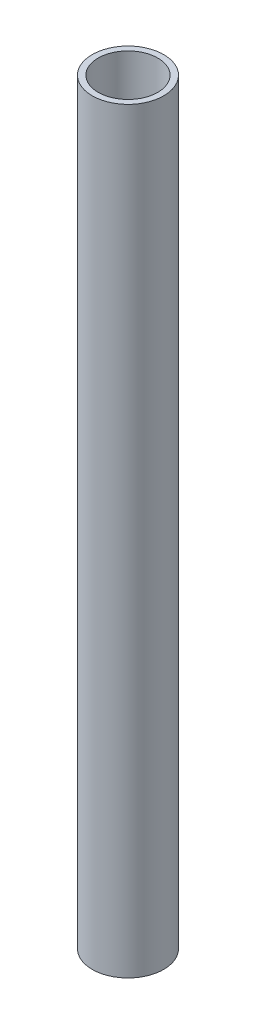
ISO-10303-21;
HEADER;
FILE_DESCRIPTION(('STEP AP214'),'2;1');
FILE_NAME('part.step','',(''),(''),'','','');
FILE_SCHEMA(('AUTOMOTIVE_DESIGN { 1 0 10303 214 1 1 1 1 }'));
ENDSEC;
DATA;
#1=APPLICATION_CONTEXT('core data for automotive mechanical design processes');
#2=APPLICATION_PROTOCOL_DEFINITION('international standard','automotive_design',2000,#1);
#3=PRODUCT_CONTEXT('',#1,'mechanical');
#4=PRODUCT('Part','Part','',(#3));
#5=PRODUCT_RELATED_PRODUCT_CATEGORY('part','',(#4));
#6=PRODUCT_DEFINITION_FORMATION('','',#4);
#7=PRODUCT_DEFINITION_CONTEXT('part definition',#1,'design');
#8=PRODUCT_DEFINITION('design','',#6,#7);
#9=PRODUCT_DEFINITION_SHAPE('','',#8);
#10=(LENGTH_UNIT() NAMED_UNIT(*) SI_UNIT(.MILLI.,.METRE.));
#11=(NAMED_UNIT(*) PLANE_ANGLE_UNIT() SI_UNIT($,.RADIAN.));
#12=(NAMED_UNIT(*) SI_UNIT($,.STERADIAN.) SOLID_ANGLE_UNIT());
#13=UNCERTAINTY_MEASURE_WITH_UNIT(LENGTH_MEASURE(1.E-05),#10,'distance_accuracy_value','');
#14=(GEOMETRIC_REPRESENTATION_CONTEXT(3) GLOBAL_UNCERTAINTY_ASSIGNED_CONTEXT((#13)) GLOBAL_UNIT_ASSIGNED_CONTEXT((#10,
#11,#12)) REPRESENTATION_CONTEXT('',''));
#15=CARTESIAN_POINT('',(0.,0.,0.));
#16=DIRECTION('',(0.,0.,1.));
#17=DIRECTION('',(1.,0.,0.));
#18=AXIS2_PLACEMENT_3D('',#15,#16,#17);
#19=CARTESIAN_POINT('',(0.,127.,0.));
#20=DIRECTION('',(0.,1.,0.));
#21=DIRECTION('',(0.,0.,1.));
#22=AXIS2_PLACEMENT_3D('',#19,#20,#21);
#23=PLANE('',#22);
#24=CARTESIAN_POINT('',(0.,127.,0.));
#25=DIRECTION('',(0.,1.,0.));
#26=DIRECTION('',(0.,0.,1.));
#27=AXIS2_PLACEMENT_3D('',#24,#25,#26);
#28=CIRCLE('',#27,6.);
#29=CARTESIAN_POINT('',(0.,127.,6.));
#30=VERTEX_POINT('',#29);
#31=EDGE_CURVE('E10',#30,#30,#28,.T.);
#32=ORIENTED_EDGE('',*,*,#31,.T.);
#33=EDGE_LOOP('',(#32));
#34=FACE_BOUND('',#33,.T.);
#35=CARTESIAN_POINT('',(0.,127.,0.));
#36=DIRECTION('',(0.,1.,0.));
#37=DIRECTION('',(0.,0.,1.));
#38=AXIS2_PLACEMENT_3D('',#35,#36,#37);
#39=CIRCLE('',#38,5.);
#40=CARTESIAN_POINT('',(0.,127.,5.));
#41=VERTEX_POINT('',#40);
#42=EDGE_CURVE('E42',#41,#41,#39,.T.);
#43=ORIENTED_EDGE('',*,*,#42,.F.);
#44=EDGE_LOOP('',(#43));
#45=FACE_BOUND('',#44,.T.);
#46=ADVANCED_FACE('F31',(#34,#45),#23,.T.);
#47=CARTESIAN_POINT('',(0.,0.,0.));
#48=DIRECTION('',(0.,1.,0.));
#49=DIRECTION('',(0.,0.,1.));
#50=AXIS2_PLACEMENT_3D('',#47,#48,#49);
#51=PLANE('',#50);
#52=CARTESIAN_POINT('',(0.,0.,0.));
#53=DIRECTION('',(0.,1.,0.));
#54=DIRECTION('',(0.,0.,1.));
#55=AXIS2_PLACEMENT_3D('',#52,#53,#54);
#56=CIRCLE('',#55,6.);
#57=CARTESIAN_POINT('',(0.,0.,6.));
#58=VERTEX_POINT('',#57);
#59=EDGE_CURVE('E35',#58,#58,#56,.T.);
#60=ORIENTED_EDGE('',*,*,#59,.F.);
#61=EDGE_LOOP('',(#60));
#62=FACE_BOUND('',#61,.T.);
#63=CARTESIAN_POINT('',(0.,0.,0.));
#64=DIRECTION('',(0.,1.,0.));
#65=DIRECTION('',(0.,0.,1.));
#66=AXIS2_PLACEMENT_3D('',#63,#64,#65);
#67=CIRCLE('',#66,5.);
#68=CARTESIAN_POINT('',(0.,0.,5.));
#69=VERTEX_POINT('',#68);
#70=EDGE_CURVE('E44',#69,#69,#67,.T.);
#71=ORIENTED_EDGE('',*,*,#70,.T.);
#72=EDGE_LOOP('',(#71));
#73=FACE_BOUND('',#72,.T.);
#74=ADVANCED_FACE('F54',(#62,#73),#51,.F.);
#75=CARTESIAN_POINT('',(0.,127.,0.));
#76=DIRECTION('',(0.,-1.,0.));
#77=DIRECTION('',(0.,0.,-1.));
#78=AXIS2_PLACEMENT_3D('',#75,#76,#77);
#79=CYLINDRICAL_SURFACE('',#78,6.);
#80=ORIENTED_EDGE('',*,*,#31,.F.);
#81=EDGE_LOOP('',(#80));
#82=FACE_BOUND('',#81,.T.);
#83=ORIENTED_EDGE('',*,*,#59,.T.);
#84=EDGE_LOOP('',(#83));
#85=FACE_BOUND('',#84,.T.);
#86=ADVANCED_FACE('F33',(#82,#85),#79,.T.);
#87=CARTESIAN_POINT('',(0.,127.,0.));
#88=DIRECTION('',(0.,-1.,0.));
#89=DIRECTION('',(0.,0.,-1.));
#90=AXIS2_PLACEMENT_3D('',#87,#88,#89);
#91=CYLINDRICAL_SURFACE('',#90,5.);
#92=ORIENTED_EDGE('',*,*,#42,.T.);
#93=EDGE_LOOP('',(#92));
#94=FACE_BOUND('',#93,.T.);
#95=ORIENTED_EDGE('',*,*,#70,.F.);
#96=EDGE_LOOP('',(#95));
#97=FACE_BOUND('',#96,.T.);
#98=ADVANCED_FACE('F50',(#94,#97),#91,.F.);
#99=CLOSED_SHELL('',(#46,#74,#86,#98));
#100=MANIFOLD_SOLID_BREP('B2',#99);
#101=ADVANCED_BREP_SHAPE_REPRESENTATION('',(#18,#100),#14);
#102=SHAPE_DEFINITION_REPRESENTATION(#9,#101);
ENDSEC;
END-ISO-10303-21;
